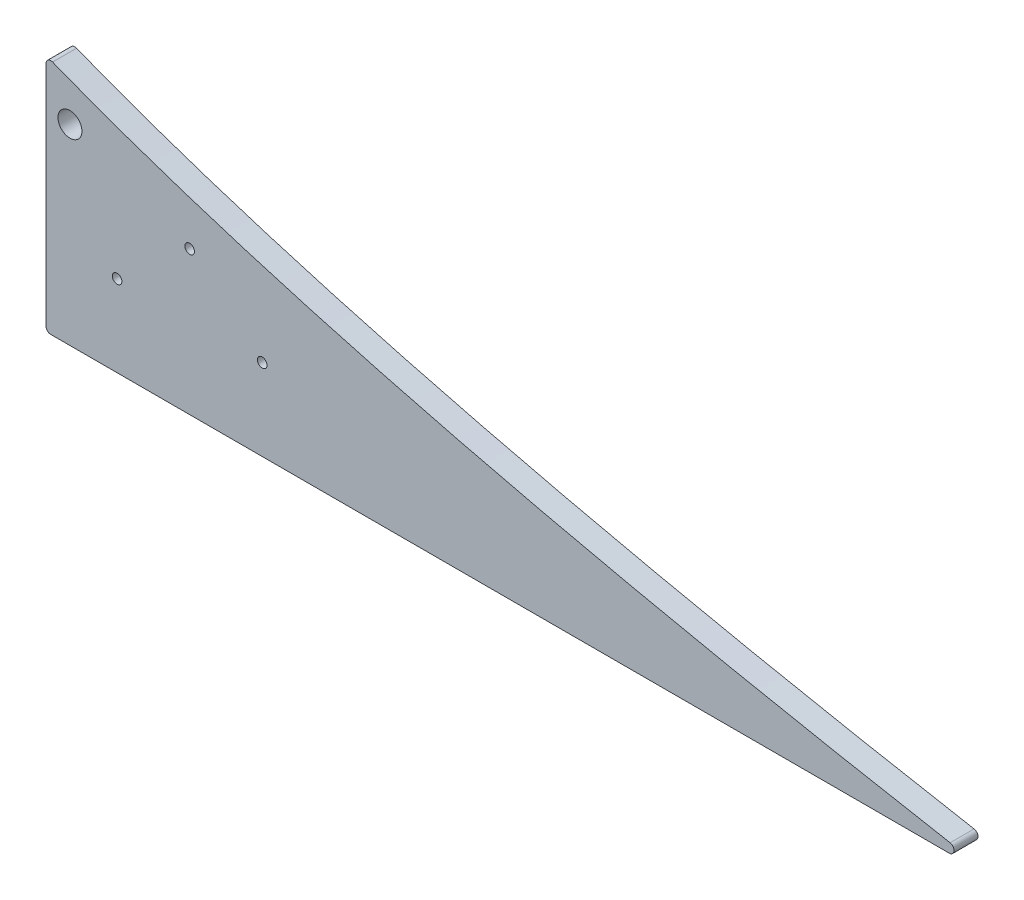
ISO-10303-21;
HEADER;
FILE_DESCRIPTION(('STEP AP214'),'2;1');
FILE_NAME('part.step','',(''),(''),'','','');
FILE_SCHEMA(('AUTOMOTIVE_DESIGN { 1 0 10303 214 1 1 1 1 }'));
ENDSEC;
DATA;
#1=APPLICATION_CONTEXT('core data for automotive mechanical design processes');
#2=APPLICATION_PROTOCOL_DEFINITION('international standard','automotive_design',2000,#1);
#3=PRODUCT_CONTEXT('',#1,'mechanical');
#4=PRODUCT('Part','Part','',(#3));
#5=PRODUCT_RELATED_PRODUCT_CATEGORY('part','',(#4));
#6=PRODUCT_DEFINITION_FORMATION('','',#4);
#7=PRODUCT_DEFINITION_CONTEXT('part definition',#1,'design');
#8=PRODUCT_DEFINITION('design','',#6,#7);
#9=PRODUCT_DEFINITION_SHAPE('','',#8);
#10=(LENGTH_UNIT() NAMED_UNIT(*) SI_UNIT(.MILLI.,.METRE.));
#11=(NAMED_UNIT(*) PLANE_ANGLE_UNIT() SI_UNIT($,.RADIAN.));
#12=(NAMED_UNIT(*) SI_UNIT($,.STERADIAN.) SOLID_ANGLE_UNIT());
#13=UNCERTAINTY_MEASURE_WITH_UNIT(LENGTH_MEASURE(1.E-05),#10,'distance_accuracy_value','');
#14=(GEOMETRIC_REPRESENTATION_CONTEXT(3) GLOBAL_UNCERTAINTY_ASSIGNED_CONTEXT((#13)) GLOBAL_UNIT_ASSIGNED_CONTEXT((#10,
#11,#12)) REPRESENTATION_CONTEXT('',''));
#15=CARTESIAN_POINT('',(0.,0.,0.));
#16=DIRECTION('',(0.,0.,1.));
#17=DIRECTION('',(1.,0.,0.));
#18=AXIS2_PLACEMENT_3D('',#15,#16,#17);
#19=CARTESIAN_POINT('',(211.923486022132,61.2903568455649,12.7));
#20=DIRECTION('',(0.,0.,-1.));
#21=DIRECTION('',(-1.,0.,0.));
#22=AXIS2_PLACEMENT_3D('',#19,#20,#21);
#23=PLANE('',#22);
#24=CARTESIAN_POINT('',(114.69116,43.20032,12.7));
#25=DIRECTION('',(0.,0.,1.));
#26=DIRECTION('',(1.,0.,0.));
#27=AXIS2_PLACEMENT_3D('',#24,#25,#26);
#28=CIRCLE('',#27,2.54);
#29=CARTESIAN_POINT('',(117.23116,43.20032,12.7));
#30=VERTEX_POINT('',#29);
#31=EDGE_CURVE('E152',#30,#30,#28,.T.);
#32=ORIENTED_EDGE('',*,*,#31,.F.);
#33=EDGE_LOOP('',(#32));
#34=FACE_BOUND('',#33,.T.);
#35=CARTESIAN_POINT('',(37.70884,43.20032,12.7));
#36=DIRECTION('',(0.,0.,1.));
#37=DIRECTION('',(1.,0.,0.));
#38=AXIS2_PLACEMENT_3D('',#35,#36,#37);
#39=CIRCLE('',#38,2.53999999999999);
#40=CARTESIAN_POINT('',(40.24884,43.20032,12.7));
#41=VERTEX_POINT('',#40);
#42=EDGE_CURVE('E142',#41,#41,#39,.T.);
#43=ORIENTED_EDGE('',*,*,#42,.F.);
#44=EDGE_LOOP('',(#43));
#45=FACE_BOUND('',#44,.T.);
#46=CARTESIAN_POINT('',(76.2,76.2,12.7));
#47=DIRECTION('',(0.,0.,1.));
#48=DIRECTION('',(1.,0.,0.));
#49=AXIS2_PLACEMENT_3D('',#46,#47,#48);
#50=CIRCLE('',#49,2.53999999999999);
#51=CARTESIAN_POINT('',(78.74,76.2,12.7));
#52=VERTEX_POINT('',#51);
#53=EDGE_CURVE('E139',#52,#52,#50,.T.);
#54=ORIENTED_EDGE('',*,*,#53,.F.);
#55=EDGE_LOOP('',(#54));
#56=FACE_BOUND('',#55,.T.);
#57=DIRECTION('',(0.,-1.,0.));
#58=VECTOR('',#57,1.);
#59=CARTESIAN_POINT('',(0.,0.,12.7));
#60=LINE('',#59,#58);
#61=CARTESIAN_POINT('',(0.,123.256640408703,12.7));
#62=VERTEX_POINT('',#61);
#63=CARTESIAN_POINT('',(0.,2.54,12.7));
#64=VERTEX_POINT('',#63);
#65=EDGE_CURVE('E105',#62,#64,#60,.T.);
#66=ORIENTED_EDGE('',*,*,#65,.T.);
#67=CARTESIAN_POINT('',(2.53999999999999,2.54,12.7));
#68=DIRECTION('',(0.,0.,-1.));
#69=DIRECTION('',(-1.,0.,0.));
#70=AXIS2_PLACEMENT_3D('',#67,#68,#69);
#71=CIRCLE('',#70,2.54);
#72=CARTESIAN_POINT('',(2.53999999999999,0.,12.7));
#73=VERTEX_POINT('',#72);
#74=EDGE_CURVE('E42',#64,#73,#71,.F.);
#75=ORIENTED_EDGE('',*,*,#74,.T.);
#76=DIRECTION('',(1.,0.,0.));
#77=VECTOR('',#76,1.);
#78=CARTESIAN_POINT('',(508.,0.,12.7));
#79=LINE('',#78,#77);
#80=CARTESIAN_POINT('',(479.099890022975,0.,12.7));
#81=VERTEX_POINT('',#80);
#82=EDGE_CURVE('E111',#73,#81,#79,.T.);
#83=ORIENTED_EDGE('',*,*,#82,.T.);
#84=CARTESIAN_POINT('',(479.099890022975,2.54000000000003,12.7));
#85=DIRECTION('',(0.,0.,-1.));
#86=DIRECTION('',(-1.,0.,0.));
#87=AXIS2_PLACEMENT_3D('',#84,#85,#86);
#88=CIRCLE('',#87,2.54);
#89=CARTESIAN_POINT('',(479.548959203002,5.03998737427818,12.7));
#90=VERTEX_POINT('',#89);
#91=EDGE_CURVE('E50',#81,#90,#88,.F.);
#92=ORIENTED_EDGE('',*,*,#91,.T.);
#93=CARTESIAN_POINT('',(508.000000000001,-1.04948429841887E-13,12.7));
#94=CARTESIAN_POINT('',(169.846972044265,59.0807136911298,12.7));
#95=CARTESIAN_POINT('',(0.,127.,12.7));
#96=B_SPLINE_CURVE_WITH_KNOTS('',2,(#93,#94,#95),.UNSPECIFIED.,.F.,.F.,(3,3),(0.,1.),.UNSPECIFIED.);
#97=CARTESIAN_POINT('',(3.47389515778096,125.6187241994,12.7));
#98=VERTEX_POINT('',#97);
#99=EDGE_CURVE('E114',#90,#98,#96,.T.);
#100=ORIENTED_EDGE('',*,*,#99,.T.);
#101=CARTESIAN_POINT('',(2.54,123.256640408703,12.7));
#102=DIRECTION('',(0.,0.,-1.));
#103=DIRECTION('',(-1.,0.,0.));
#104=AXIS2_PLACEMENT_3D('',#101,#102,#103);
#105=CIRCLE('',#104,2.54);
#106=EDGE_CURVE('E123',#98,#62,#105,.F.);
#107=ORIENTED_EDGE('',*,*,#106,.T.);
#108=EDGE_LOOP('',(#66,#75,#83,#92,#100,#107));
#109=FACE_BOUND('',#108,.T.);
#110=CARTESIAN_POINT('',(12.7,101.6,12.7));
#111=DIRECTION('',(0.,0.,1.));
#112=DIRECTION('',(1.,0.,0.));
#113=AXIS2_PLACEMENT_3D('',#110,#111,#112);
#114=CIRCLE('',#113,6.35);
#115=CARTESIAN_POINT('',(19.05,101.6,12.7));
#116=VERTEX_POINT('',#115);
#117=EDGE_CURVE('E155',#116,#116,#114,.T.);
#118=ORIENTED_EDGE('',*,*,#117,.F.);
#119=EDGE_LOOP('',(#118));
#120=FACE_BOUND('',#119,.T.);
#121=ADVANCED_FACE('F33',(#34,#45,#56,#109,#120),#23,.F.);
#122=CARTESIAN_POINT('',(211.923486022132,61.2903568455649,0.));
#123=DIRECTION('',(0.,0.,-1.));
#124=DIRECTION('',(-1.,0.,0.));
#125=AXIS2_PLACEMENT_3D('',#122,#123,#124);
#126=PLANE('',#125);
#127=CARTESIAN_POINT('',(114.69116,43.20032,0.));
#128=DIRECTION('',(0.,0.,-1.));
#129=DIRECTION('',(-1.,0.,0.));
#130=AXIS2_PLACEMENT_3D('',#127,#128,#129);
#131=CIRCLE('',#130,2.54);
#132=CARTESIAN_POINT('',(112.15116,43.20032,0.));
#133=VERTEX_POINT('',#132);
#134=EDGE_CURVE('E37',#133,#133,#131,.T.);
#135=ORIENTED_EDGE('',*,*,#134,.F.);
#136=EDGE_LOOP('',(#135));
#137=FACE_BOUND('',#136,.T.);
#138=CARTESIAN_POINT('',(37.70884,43.20032,0.));
#139=DIRECTION('',(0.,0.,-1.));
#140=DIRECTION('',(-1.,0.,0.));
#141=AXIS2_PLACEMENT_3D('',#138,#139,#140);
#142=CIRCLE('',#141,2.53999999999999);
#143=CARTESIAN_POINT('',(35.16884,43.20032,0.));
#144=VERTEX_POINT('',#143);
#145=EDGE_CURVE('E140',#144,#144,#142,.T.);
#146=ORIENTED_EDGE('',*,*,#145,.F.);
#147=EDGE_LOOP('',(#146));
#148=FACE_BOUND('',#147,.T.);
#149=CARTESIAN_POINT('',(76.2,76.2,0.));
#150=DIRECTION('',(0.,0.,-1.));
#151=DIRECTION('',(-1.,0.,0.));
#152=AXIS2_PLACEMENT_3D('',#149,#150,#151);
#153=CIRCLE('',#152,2.53999999999999);
#154=CARTESIAN_POINT('',(73.66,76.2,0.));
#155=VERTEX_POINT('',#154);
#156=EDGE_CURVE('E136',#155,#155,#153,.T.);
#157=ORIENTED_EDGE('',*,*,#156,.F.);
#158=EDGE_LOOP('',(#157));
#159=FACE_BOUND('',#158,.T.);
#160=DIRECTION('',(1.,0.,0.));
#161=VECTOR('',#160,1.);
#162=CARTESIAN_POINT('',(508.,0.,0.));
#163=LINE('',#162,#161);
#164=CARTESIAN_POINT('',(2.53999999999999,0.,0.));
#165=VERTEX_POINT('',#164);
#166=CARTESIAN_POINT('',(479.099890022975,0.,0.));
#167=VERTEX_POINT('',#166);
#168=EDGE_CURVE('E116',#165,#167,#163,.T.);
#169=ORIENTED_EDGE('',*,*,#168,.F.);
#170=CARTESIAN_POINT('',(2.53999999999999,2.54,0.));
#171=DIRECTION('',(0.,0.,-1.));
#172=DIRECTION('',(-1.,0.,0.));
#173=AXIS2_PLACEMENT_3D('',#170,#171,#172);
#174=CIRCLE('',#173,2.54);
#175=CARTESIAN_POINT('',(0.,2.54,0.));
#176=VERTEX_POINT('',#175);
#177=EDGE_CURVE('E110',#165,#176,#174,.T.);
#178=ORIENTED_EDGE('',*,*,#177,.T.);
#179=DIRECTION('',(0.,-1.,0.));
#180=VECTOR('',#179,1.);
#181=CARTESIAN_POINT('',(0.,0.,0.));
#182=LINE('',#181,#180);
#183=CARTESIAN_POINT('',(0.,123.256640408703,0.));
#184=VERTEX_POINT('',#183);
#185=EDGE_CURVE('E104',#184,#176,#182,.T.);
#186=ORIENTED_EDGE('',*,*,#185,.F.);
#187=CARTESIAN_POINT('',(2.54,123.256640408703,0.));
#188=DIRECTION('',(0.,0.,-1.));
#189=DIRECTION('',(-1.,0.,0.));
#190=AXIS2_PLACEMENT_3D('',#187,#188,#189);
#191=CIRCLE('',#190,2.54);
#192=CARTESIAN_POINT('',(3.47389515778096,125.6187241994,0.));
#193=VERTEX_POINT('',#192);
#194=EDGE_CURVE('E92',#184,#193,#191,.T.);
#195=ORIENTED_EDGE('',*,*,#194,.T.);
#196=CARTESIAN_POINT('',(508.000000000001,-1.04948429841887E-13,0.));
#197=CARTESIAN_POINT('',(169.846972044265,59.0807136911298,0.));
#198=CARTESIAN_POINT('',(0.,127.,0.));
#199=B_SPLINE_CURVE_WITH_KNOTS('',2,(#196,#197,#198),.UNSPECIFIED.,.F.,.F.,(3,3),(0.,1.),.UNSPECIFIED.);
#200=CARTESIAN_POINT('',(479.548959203001,5.03998737427819,0.));
#201=VERTEX_POINT('',#200);
#202=EDGE_CURVE('E112',#201,#193,#199,.T.);
#203=ORIENTED_EDGE('',*,*,#202,.F.);
#204=CARTESIAN_POINT('',(479.099890022975,2.54000000000003,0.));
#205=DIRECTION('',(0.,0.,-1.));
#206=DIRECTION('',(-1.,0.,0.));
#207=AXIS2_PLACEMENT_3D('',#204,#205,#206);
#208=CIRCLE('',#207,2.54);
#209=EDGE_CURVE('E130',#201,#167,#208,.T.);
#210=ORIENTED_EDGE('',*,*,#209,.T.);
#211=EDGE_LOOP('',(#169,#178,#186,#195,#203,#210));
#212=FACE_BOUND('',#211,.T.);
#213=CARTESIAN_POINT('',(12.7,101.6,0.));
#214=DIRECTION('',(0.,0.,1.));
#215=DIRECTION('',(1.,0.,0.));
#216=AXIS2_PLACEMENT_3D('',#213,#214,#215);
#217=CIRCLE('',#216,6.35);
#218=CARTESIAN_POINT('',(19.05,101.6,0.));
#219=VERTEX_POINT('',#218);
#220=EDGE_CURVE('E138',#219,#219,#217,.T.);
#221=ORIENTED_EDGE('',*,*,#220,.T.);
#222=EDGE_LOOP('',(#221));
#223=FACE_BOUND('',#222,.T.);
#224=ADVANCED_FACE('F108',(#137,#148,#159,#212,#223),#126,.T.);
#225=CARTESIAN_POINT('',(508.,0.,12.7));
#226=DIRECTION('',(0.,1.,0.));
#227=DIRECTION('',(-1.,0.,0.));
#228=AXIS2_PLACEMENT_3D('',#225,#226,#227);
#229=PLANE('',#228);
#230=ORIENTED_EDGE('',*,*,#82,.F.);
#231=DIRECTION('',(0.,0.,-1.));
#232=VECTOR('',#231,1.);
#233=CARTESIAN_POINT('',(2.53999999999999,0.,12.7));
#234=LINE('',#233,#232);
#235=EDGE_CURVE('E127',#73,#165,#234,.T.);
#236=ORIENTED_EDGE('',*,*,#235,.T.);
#237=ORIENTED_EDGE('',*,*,#168,.T.);
#238=DIRECTION('',(0.,0.,-1.));
#239=VECTOR('',#238,1.);
#240=CARTESIAN_POINT('',(479.099890022975,0.,12.7));
#241=LINE('',#240,#239);
#242=EDGE_CURVE('E125',#167,#81,#241,.F.);
#243=ORIENTED_EDGE('',*,*,#242,.T.);
#244=EDGE_LOOP('',(#230,#236,#237,#243));
#245=FACE_BOUND('',#244,.T.);
#246=ADVANCED_FACE('F172',(#245),#229,.F.);
#247=DIRECTION('',(0.,0.,-1.));
#248=VECTOR('',#247,1.);
#249=SURFACE_OF_LINEAR_EXTRUSION('',#96,#248);
#250=ORIENTED_EDGE('',*,*,#99,.F.);
#251=DIRECTION('',(0.,0.,-1.));
#252=VECTOR('',#251,1.);
#253=CARTESIAN_POINT('',(479.548959203002,5.03998737427818,12.7));
#254=LINE('',#253,#252);
#255=EDGE_CURVE('E11',#90,#201,#254,.T.);
#256=ORIENTED_EDGE('',*,*,#255,.T.);
#257=ORIENTED_EDGE('',*,*,#202,.T.);
#258=DIRECTION('',(0.,0.,-1.));
#259=VECTOR('',#258,1.);
#260=CARTESIAN_POINT('',(3.47389515778077,125.6187241994,0.));
#261=LINE('',#260,#259);
#262=EDGE_CURVE('E98',#193,#98,#261,.F.);
#263=ORIENTED_EDGE('',*,*,#262,.T.);
#264=EDGE_LOOP('',(#250,#256,#257,#263));
#265=FACE_BOUND('',#264,.T.);
#266=ADVANCED_FACE('F168',(#265),#249,.F.);
#267=CARTESIAN_POINT('',(0.,0.,12.7));
#268=DIRECTION('',(1.,0.,0.));
#269=DIRECTION('',(0.,0.,-1.));
#270=AXIS2_PLACEMENT_3D('',#267,#268,#269);
#271=PLANE('',#270);
#272=ORIENTED_EDGE('',*,*,#185,.T.);
#273=DIRECTION('',(0.,0.,-1.));
#274=VECTOR('',#273,1.);
#275=CARTESIAN_POINT('',(0.,2.54,12.7));
#276=LINE('',#275,#274);
#277=EDGE_CURVE('E58',#176,#64,#276,.F.);
#278=ORIENTED_EDGE('',*,*,#277,.T.);
#279=ORIENTED_EDGE('',*,*,#65,.F.);
#280=DIRECTION('',(0.,0.,-1.));
#281=VECTOR('',#280,1.);
#282=CARTESIAN_POINT('',(0.,123.256640408703,12.7));
#283=LINE('',#282,#281);
#284=EDGE_CURVE('E96',#62,#184,#283,.T.);
#285=ORIENTED_EDGE('',*,*,#284,.T.);
#286=EDGE_LOOP('',(#272,#278,#279,#285));
#287=FACE_BOUND('',#286,.T.);
#288=ADVANCED_FACE('F103',(#287),#271,.F.);
#289=CARTESIAN_POINT('',(12.7,101.6,12.7));
#290=DIRECTION('',(0.,0.,-1.));
#291=DIRECTION('',(-1.,0.,0.));
#292=AXIS2_PLACEMENT_3D('',#289,#290,#291);
#293=CYLINDRICAL_SURFACE('',#292,6.35);
#294=ORIENTED_EDGE('',*,*,#117,.T.);
#295=EDGE_LOOP('',(#294));
#296=FACE_BOUND('',#295,.T.);
#297=ORIENTED_EDGE('',*,*,#220,.F.);
#298=EDGE_LOOP('',(#297));
#299=FACE_BOUND('',#298,.T.);
#300=ADVANCED_FACE('F180',(#296,#299),#293,.F.);
#301=CARTESIAN_POINT('',(2.54,123.256640408703,6.35));
#302=DIRECTION('',(0.,0.,-1.));
#303=DIRECTION('',(-1.,0.,0.));
#304=AXIS2_PLACEMENT_3D('',#301,#302,#303);
#305=CYLINDRICAL_SURFACE('',#304,2.54);
#306=ORIENTED_EDGE('',*,*,#106,.F.);
#307=ORIENTED_EDGE('',*,*,#262,.F.);
#308=ORIENTED_EDGE('',*,*,#194,.F.);
#309=ORIENTED_EDGE('',*,*,#284,.F.);
#310=EDGE_LOOP('',(#306,#307,#308,#309));
#311=FACE_BOUND('',#310,.T.);
#312=ADVANCED_FACE('F95',(#311),#305,.T.);
#313=CARTESIAN_POINT('',(2.53999999999999,2.54,12.7));
#314=DIRECTION('',(0.,0.,-1.));
#315=DIRECTION('',(-1.,0.,0.));
#316=AXIS2_PLACEMENT_3D('',#313,#314,#315);
#317=CYLINDRICAL_SURFACE('',#316,2.54);
#318=ORIENTED_EDGE('',*,*,#74,.F.);
#319=ORIENTED_EDGE('',*,*,#277,.F.);
#320=ORIENTED_EDGE('',*,*,#177,.F.);
#321=ORIENTED_EDGE('',*,*,#235,.F.);
#322=EDGE_LOOP('',(#318,#319,#320,#321));
#323=FACE_BOUND('',#322,.T.);
#324=ADVANCED_FACE('F179',(#323),#317,.T.);
#325=CARTESIAN_POINT('',(479.099890022975,2.54000000000003,6.35));
#326=DIRECTION('',(0.,0.,-1.));
#327=DIRECTION('',(-1.,0.,0.));
#328=AXIS2_PLACEMENT_3D('',#325,#326,#327);
#329=CYLINDRICAL_SURFACE('',#328,2.54);
#330=ORIENTED_EDGE('',*,*,#91,.F.);
#331=ORIENTED_EDGE('',*,*,#242,.F.);
#332=ORIENTED_EDGE('',*,*,#209,.F.);
#333=ORIENTED_EDGE('',*,*,#255,.F.);
#334=EDGE_LOOP('',(#330,#331,#332,#333));
#335=FACE_BOUND('',#334,.T.);
#336=ADVANCED_FACE('F35',(#335),#329,.T.);
#337=CARTESIAN_POINT('',(76.2,76.2,-190.5));
#338=DIRECTION('',(0.,0.,1.));
#339=DIRECTION('',(1.,0.,0.));
#340=AXIS2_PLACEMENT_3D('',#337,#338,#339);
#341=CYLINDRICAL_SURFACE('',#340,2.53999999999999);
#342=ORIENTED_EDGE('',*,*,#156,.T.);
#343=EDGE_LOOP('',(#342));
#344=FACE_BOUND('',#343,.T.);
#345=ORIENTED_EDGE('',*,*,#53,.T.);
#346=EDGE_LOOP('',(#345));
#347=FACE_BOUND('',#346,.T.);
#348=ADVANCED_FACE('F186',(#344,#347),#341,.F.);
#349=CARTESIAN_POINT('',(37.70884,43.20032,-190.5));
#350=DIRECTION('',(0.,0.,1.));
#351=DIRECTION('',(1.,0.,0.));
#352=AXIS2_PLACEMENT_3D('',#349,#350,#351);
#353=CYLINDRICAL_SURFACE('',#352,2.53999999999999);
#354=ORIENTED_EDGE('',*,*,#145,.T.);
#355=EDGE_LOOP('',(#354));
#356=FACE_BOUND('',#355,.T.);
#357=ORIENTED_EDGE('',*,*,#42,.T.);
#358=EDGE_LOOP('',(#357));
#359=FACE_BOUND('',#358,.T.);
#360=ADVANCED_FACE('F205',(#356,#359),#353,.F.);
#361=CARTESIAN_POINT('',(114.69116,43.20032,-190.5));
#362=DIRECTION('',(0.,0.,1.));
#363=DIRECTION('',(1.,0.,0.));
#364=AXIS2_PLACEMENT_3D('',#361,#362,#363);
#365=CYLINDRICAL_SURFACE('',#364,2.54);
#366=ORIENTED_EDGE('',*,*,#134,.T.);
#367=EDGE_LOOP('',(#366));
#368=FACE_BOUND('',#367,.T.);
#369=ORIENTED_EDGE('',*,*,#31,.T.);
#370=EDGE_LOOP('',(#369));
#371=FACE_BOUND('',#370,.T.);
#372=ADVANCED_FACE('F209',(#368,#371),#365,.F.);
#373=CLOSED_SHELL('',(#121,#224,#246,#266,#288,#300,#312,#324,#336,#348,#360,#372));
#374=MANIFOLD_SOLID_BREP('B2',#373);
#375=ADVANCED_BREP_SHAPE_REPRESENTATION('',(#18,#374),#14);
#376=SHAPE_DEFINITION_REPRESENTATION(#9,#375);
ENDSEC;
END-ISO-10303-21;
